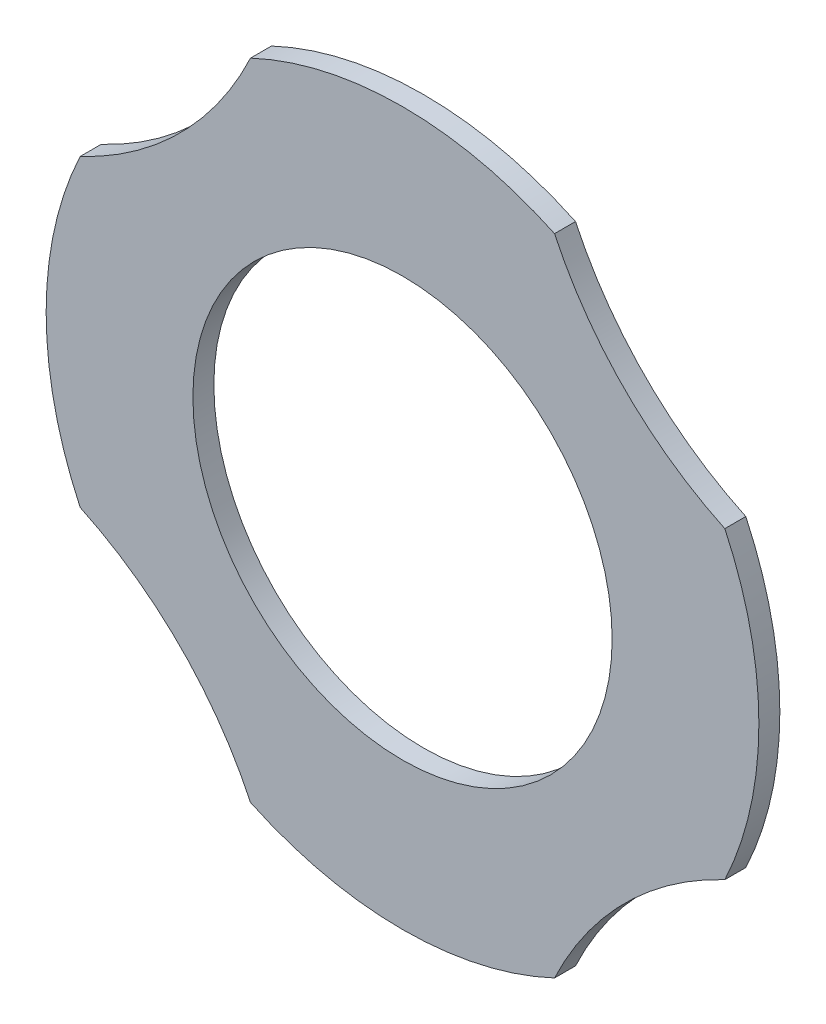
ISO-10303-21;
HEADER;
FILE_DESCRIPTION(('STEP AP214'),'2;1');
FILE_NAME('part.step','',(''),(''),'','','');
FILE_SCHEMA(('AUTOMOTIVE_DESIGN { 1 0 10303 214 1 1 1 1 }'));
ENDSEC;
DATA;
#1=APPLICATION_CONTEXT('core data for automotive mechanical design processes');
#2=APPLICATION_PROTOCOL_DEFINITION('international standard','automotive_design',2000,#1);
#3=PRODUCT_CONTEXT('',#1,'mechanical');
#4=PRODUCT('Part','Part','',(#3));
#5=PRODUCT_RELATED_PRODUCT_CATEGORY('part','',(#4));
#6=PRODUCT_DEFINITION_FORMATION('','',#4);
#7=PRODUCT_DEFINITION_CONTEXT('part definition',#1,'design');
#8=PRODUCT_DEFINITION('design','',#6,#7);
#9=PRODUCT_DEFINITION_SHAPE('','',#8);
#10=(LENGTH_UNIT() NAMED_UNIT(*) SI_UNIT(.MILLI.,.METRE.));
#11=(NAMED_UNIT(*) PLANE_ANGLE_UNIT() SI_UNIT($,.RADIAN.));
#12=(NAMED_UNIT(*) SI_UNIT($,.STERADIAN.) SOLID_ANGLE_UNIT());
#13=UNCERTAINTY_MEASURE_WITH_UNIT(LENGTH_MEASURE(1.E-05),#10,'distance_accuracy_value','');
#14=(GEOMETRIC_REPRESENTATION_CONTEXT(3) GLOBAL_UNCERTAINTY_ASSIGNED_CONTEXT((#13)) GLOBAL_UNIT_ASSIGNED_CONTEXT((#10,
#11,#12)) REPRESENTATION_CONTEXT('',''));
#15=CARTESIAN_POINT('',(0.,0.,0.));
#16=DIRECTION('',(0.,0.,1.));
#17=DIRECTION('',(1.,0.,0.));
#18=AXIS2_PLACEMENT_3D('',#15,#16,#17);
#19=CARTESIAN_POINT('',(-226.274169979693,546.274169979696,10.));
#20=DIRECTION('',(0.,0.,-1.));
#21=DIRECTION('',(-1.,0.,0.));
#22=AXIS2_PLACEMENT_3D('',#19,#20,#21);
#23=CYLINDRICAL_SURFACE('',#22,170.);
#24=CARTESIAN_POINT('',(-226.274169979693,546.274169979696,0.));
#25=DIRECTION('',(0.,0.,-1.));
#26=DIRECTION('',(1.,0.,0.));
#27=AXIS2_PLACEMENT_3D('',#24,#25,#26);
#28=CIRCLE('',#27,170.);
#29=CARTESIAN_POINT('',(-72.5168929666655,473.757277013029,0.));
#30=VERTEX_POINT('',#29);
#31=CARTESIAN_POINT('',(-153.757277013025,392.516892966669,0.));
#32=VERTEX_POINT('',#31);
#33=EDGE_CURVE('E144',#30,#32,#28,.T.);
#34=ORIENTED_EDGE('',*,*,#33,.T.);
#35=DIRECTION('',(0.,0.,-1.));
#36=VECTOR('',#35,1.);
#37=CARTESIAN_POINT('',(-153.757277013025,392.516892966669,10.));
#38=LINE('',#37,#36);
#39=CARTESIAN_POINT('',(-153.757277013025,392.516892966669,10.));
#40=VERTEX_POINT('',#39);
#41=EDGE_CURVE('E11',#40,#32,#38,.T.);
#42=ORIENTED_EDGE('',*,*,#41,.F.);
#43=CARTESIAN_POINT('',(-226.274169979693,546.274169979696,10.));
#44=DIRECTION('',(0.,0.,-1.));
#45=DIRECTION('',(1.,0.,0.));
#46=AXIS2_PLACEMENT_3D('',#43,#44,#45);
#47=CIRCLE('',#46,170.);
#48=CARTESIAN_POINT('',(-72.5168929666655,473.757277013029,10.));
#49=VERTEX_POINT('',#48);
#50=EDGE_CURVE('E167',#49,#40,#47,.T.);
#51=ORIENTED_EDGE('',*,*,#50,.F.);
#52=DIRECTION('',(0.,0.,-1.));
#53=VECTOR('',#52,1.);
#54=CARTESIAN_POINT('',(-72.5168929666655,473.757277013029,10.));
#55=LINE('',#54,#53);
#56=EDGE_CURVE('E140',#49,#30,#55,.T.);
#57=ORIENTED_EDGE('',*,*,#56,.T.);
#58=EDGE_LOOP('',(#34,#42,#51,#57));
#59=FACE_BOUND('',#58,.T.);
#60=ADVANCED_FACE('F43',(#59),#23,.F.);
#61=CARTESIAN_POINT('',(2.26207941267376E-12,320.000000000001,10.));
#62=DIRECTION('',(0.,0.,-1.));
#63=DIRECTION('',(-1.,0.,0.));
#64=AXIS2_PLACEMENT_3D('',#61,#62,#63);
#65=CYLINDRICAL_SURFACE('',#64,170.);
#66=CARTESIAN_POINT('',(2.26207941267376E-12,320.000000000001,0.));
#67=DIRECTION('',(0.,0.,1.));
#68=DIRECTION('',(-1.,0.,0.));
#69=AXIS2_PLACEMENT_3D('',#66,#67,#68);
#70=CIRCLE('',#69,170.);
#71=CARTESIAN_POINT('',(-153.757277013025,247.483107033334,0.));
#72=VERTEX_POINT('',#71);
#73=EDGE_CURVE('E148',#32,#72,#70,.T.);
#74=ORIENTED_EDGE('',*,*,#73,.T.);
#75=DIRECTION('',(0.,0.,-1.));
#76=VECTOR('',#75,1.);
#77=CARTESIAN_POINT('',(-153.757277013025,247.483107033334,10.));
#78=LINE('',#77,#76);
#79=CARTESIAN_POINT('',(-153.757277013025,247.483107033334,10.));
#80=VERTEX_POINT('',#79);
#81=EDGE_CURVE('E52',#80,#72,#78,.T.);
#82=ORIENTED_EDGE('',*,*,#81,.F.);
#83=CARTESIAN_POINT('',(2.26207941267376E-12,320.000000000001,10.));
#84=DIRECTION('',(0.,0.,1.));
#85=DIRECTION('',(-1.,0.,0.));
#86=AXIS2_PLACEMENT_3D('',#83,#84,#85);
#87=CIRCLE('',#86,170.);
#88=EDGE_CURVE('E103',#40,#80,#87,.T.);
#89=ORIENTED_EDGE('',*,*,#88,.F.);
#90=ORIENTED_EDGE('',*,*,#41,.T.);
#91=EDGE_LOOP('',(#74,#82,#89,#90));
#92=FACE_BOUND('',#91,.T.);
#93=ADVANCED_FACE('F236',(#92),#65,.T.);
#94=CARTESIAN_POINT('',(-226.274169979693,93.7258300203062,10.));
#95=DIRECTION('',(0.,0.,-1.));
#96=DIRECTION('',(-1.,0.,0.));
#97=AXIS2_PLACEMENT_3D('',#94,#95,#96);
#98=CYLINDRICAL_SURFACE('',#97,170.);
#99=CARTESIAN_POINT('',(-226.274169979693,93.7258300203062,0.));
#100=DIRECTION('',(0.,0.,-1.));
#101=DIRECTION('',(-1.,0.,0.));
#102=AXIS2_PLACEMENT_3D('',#99,#100,#101);
#103=CIRCLE('',#102,170.);
#104=CARTESIAN_POINT('',(-72.5168929666654,166.242722986974,0.));
#105=VERTEX_POINT('',#104);
#106=EDGE_CURVE('E152',#72,#105,#103,.T.);
#107=ORIENTED_EDGE('',*,*,#106,.T.);
#108=DIRECTION('',(0.,0.,-1.));
#109=VECTOR('',#108,1.);
#110=CARTESIAN_POINT('',(-72.5168929666654,166.242722986974,10.));
#111=LINE('',#110,#109);
#112=CARTESIAN_POINT('',(-72.5168929666654,166.242722986974,10.));
#113=VERTEX_POINT('',#112);
#114=EDGE_CURVE('E178',#113,#105,#111,.T.);
#115=ORIENTED_EDGE('',*,*,#114,.F.);
#116=CARTESIAN_POINT('',(-226.274169979693,93.7258300203062,10.));
#117=DIRECTION('',(0.,0.,-1.));
#118=DIRECTION('',(-1.,0.,0.));
#119=AXIS2_PLACEMENT_3D('',#116,#117,#118);
#120=CIRCLE('',#119,170.);
#121=EDGE_CURVE('E188',#80,#113,#120,.T.);
#122=ORIENTED_EDGE('',*,*,#121,.F.);
#123=ORIENTED_EDGE('',*,*,#81,.T.);
#124=EDGE_LOOP('',(#107,#115,#122,#123));
#125=FACE_BOUND('',#124,.T.);
#126=ADVANCED_FACE('F186',(#125),#98,.F.);
#127=CARTESIAN_POINT('',(2.26207941267376E-12,320.000000000001,10.));
#128=DIRECTION('',(0.,0.,-1.));
#129=DIRECTION('',(-1.,0.,0.));
#130=AXIS2_PLACEMENT_3D('',#127,#128,#129);
#131=CYLINDRICAL_SURFACE('',#130,170.);
#132=CARTESIAN_POINT('',(2.26207941267376E-12,320.000000000001,0.));
#133=DIRECTION('',(0.,0.,1.));
#134=DIRECTION('',(-1.,0.,0.));
#135=AXIS2_PLACEMENT_3D('',#132,#133,#134);
#136=CIRCLE('',#135,170.);
#137=CARTESIAN_POINT('',(72.51689296667,166.242722986974,0.));
#138=VERTEX_POINT('',#137);
#139=EDGE_CURVE('E155',#105,#138,#136,.T.);
#140=ORIENTED_EDGE('',*,*,#139,.T.);
#141=DIRECTION('',(0.,0.,-1.));
#142=VECTOR('',#141,1.);
#143=CARTESIAN_POINT('',(72.51689296667,166.242722986974,10.));
#144=LINE('',#143,#142);
#145=CARTESIAN_POINT('',(72.51689296667,166.242722986974,10.));
#146=VERTEX_POINT('',#145);
#147=EDGE_CURVE('E174',#146,#138,#144,.T.);
#148=ORIENTED_EDGE('',*,*,#147,.F.);
#149=CARTESIAN_POINT('',(2.26207941267376E-12,320.000000000001,10.));
#150=DIRECTION('',(0.,0.,1.));
#151=DIRECTION('',(-1.,0.,0.));
#152=AXIS2_PLACEMENT_3D('',#149,#150,#151);
#153=CIRCLE('',#152,170.);
#154=EDGE_CURVE('E201',#113,#146,#153,.T.);
#155=ORIENTED_EDGE('',*,*,#154,.F.);
#156=ORIENTED_EDGE('',*,*,#114,.T.);
#157=EDGE_LOOP('',(#140,#148,#155,#156));
#158=FACE_BOUND('',#157,.T.);
#159=ADVANCED_FACE('F196',(#158),#131,.T.);
#160=CARTESIAN_POINT('',(226.274169979697,93.7258300203062,10.));
#161=DIRECTION('',(0.,0.,-1.));
#162=DIRECTION('',(-1.,0.,0.));
#163=AXIS2_PLACEMENT_3D('',#160,#161,#162);
#164=CYLINDRICAL_SURFACE('',#163,170.);
#165=CARTESIAN_POINT('',(226.274169979697,93.7258300203062,0.));
#166=DIRECTION('',(0.,0.,-1.));
#167=DIRECTION('',(-1.,0.,0.));
#168=AXIS2_PLACEMENT_3D('',#165,#166,#167);
#169=CIRCLE('',#168,170.);
#170=CARTESIAN_POINT('',(153.75727701303,247.483107033334,0.));
#171=VERTEX_POINT('',#170);
#172=EDGE_CURVE('E158',#138,#171,#169,.T.);
#173=ORIENTED_EDGE('',*,*,#172,.T.);
#174=DIRECTION('',(0.,0.,-1.));
#175=VECTOR('',#174,1.);
#176=CARTESIAN_POINT('',(153.75727701303,247.483107033334,10.));
#177=LINE('',#176,#175);
#178=CARTESIAN_POINT('',(153.75727701303,247.483107033334,10.));
#179=VERTEX_POINT('',#178);
#180=EDGE_CURVE('E133',#179,#171,#177,.T.);
#181=ORIENTED_EDGE('',*,*,#180,.F.);
#182=CARTESIAN_POINT('',(226.274169979697,93.7258300203062,10.));
#183=DIRECTION('',(0.,0.,-1.));
#184=DIRECTION('',(-1.,0.,0.));
#185=AXIS2_PLACEMENT_3D('',#182,#183,#184);
#186=CIRCLE('',#185,170.);
#187=EDGE_CURVE('E122',#146,#179,#186,.T.);
#188=ORIENTED_EDGE('',*,*,#187,.F.);
#189=ORIENTED_EDGE('',*,*,#147,.T.);
#190=EDGE_LOOP('',(#173,#181,#188,#189));
#191=FACE_BOUND('',#190,.T.);
#192=ADVANCED_FACE('F199',(#191),#164,.F.);
#193=CARTESIAN_POINT('',(2.26207941267376E-12,320.000000000001,10.));
#194=DIRECTION('',(0.,0.,-1.));
#195=DIRECTION('',(-1.,0.,0.));
#196=AXIS2_PLACEMENT_3D('',#193,#194,#195);
#197=CYLINDRICAL_SURFACE('',#196,170.);
#198=CARTESIAN_POINT('',(2.26207941267376E-12,320.000000000001,0.));
#199=DIRECTION('',(0.,0.,1.));
#200=DIRECTION('',(-1.,0.,0.));
#201=AXIS2_PLACEMENT_3D('',#198,#199,#200);
#202=CIRCLE('',#201,170.);
#203=CARTESIAN_POINT('',(153.75727701303,392.516892966669,0.));
#204=VERTEX_POINT('',#203);
#205=EDGE_CURVE('E131',#171,#204,#202,.T.);
#206=ORIENTED_EDGE('',*,*,#205,.T.);
#207=DIRECTION('',(0.,0.,-1.));
#208=VECTOR('',#207,1.);
#209=CARTESIAN_POINT('',(153.75727701303,392.516892966669,10.));
#210=LINE('',#209,#208);
#211=CARTESIAN_POINT('',(153.75727701303,392.516892966669,10.));
#212=VERTEX_POINT('',#211);
#213=EDGE_CURVE('E128',#212,#204,#210,.T.);
#214=ORIENTED_EDGE('',*,*,#213,.F.);
#215=CARTESIAN_POINT('',(2.26207941267376E-12,320.000000000001,10.));
#216=DIRECTION('',(0.,0.,1.));
#217=DIRECTION('',(-1.,0.,0.));
#218=AXIS2_PLACEMENT_3D('',#215,#216,#217);
#219=CIRCLE('',#218,170.);
#220=EDGE_CURVE('E116',#179,#212,#219,.T.);
#221=ORIENTED_EDGE('',*,*,#220,.F.);
#222=ORIENTED_EDGE('',*,*,#180,.T.);
#223=EDGE_LOOP('',(#206,#214,#221,#222));
#224=FACE_BOUND('',#223,.T.);
#225=ADVANCED_FACE('F129',(#224),#197,.T.);
#226=CARTESIAN_POINT('',(226.274169979697,546.274169979697,10.));
#227=DIRECTION('',(0.,0.,-1.));
#228=DIRECTION('',(-1.,0.,0.));
#229=AXIS2_PLACEMENT_3D('',#226,#227,#228);
#230=CYLINDRICAL_SURFACE('',#229,170.);
#231=CARTESIAN_POINT('',(226.274169979697,546.274169979697,0.));
#232=DIRECTION('',(0.,0.,-1.));
#233=DIRECTION('',(1.,0.,0.));
#234=AXIS2_PLACEMENT_3D('',#231,#232,#233);
#235=CIRCLE('',#234,170.);
#236=CARTESIAN_POINT('',(72.51689296667,473.757277013029,0.));
#237=VERTEX_POINT('',#236);
#238=EDGE_CURVE('E89',#204,#237,#235,.T.);
#239=ORIENTED_EDGE('',*,*,#238,.T.);
#240=DIRECTION('',(0.,0.,-1.));
#241=VECTOR('',#240,1.);
#242=CARTESIAN_POINT('',(72.51689296667,473.757277013029,10.));
#243=LINE('',#242,#241);
#244=CARTESIAN_POINT('',(72.51689296667,473.757277013029,10.));
#245=VERTEX_POINT('',#244);
#246=EDGE_CURVE('E134',#245,#237,#243,.T.);
#247=ORIENTED_EDGE('',*,*,#246,.F.);
#248=CARTESIAN_POINT('',(226.274169979697,546.274169979697,10.));
#249=DIRECTION('',(0.,0.,-1.));
#250=DIRECTION('',(1.,0.,0.));
#251=AXIS2_PLACEMENT_3D('',#248,#249,#250);
#252=CIRCLE('',#251,170.);
#253=EDGE_CURVE('E120',#212,#245,#252,.T.);
#254=ORIENTED_EDGE('',*,*,#253,.F.);
#255=ORIENTED_EDGE('',*,*,#213,.T.);
#256=EDGE_LOOP('',(#239,#247,#254,#255));
#257=FACE_BOUND('',#256,.T.);
#258=ADVANCED_FACE('F136',(#257),#230,.F.);
#259=CARTESIAN_POINT('',(2.26207941267376E-12,320.000000000001,10.));
#260=DIRECTION('',(0.,0.,-1.));
#261=DIRECTION('',(-1.,0.,0.));
#262=AXIS2_PLACEMENT_3D('',#259,#260,#261);
#263=CYLINDRICAL_SURFACE('',#262,170.);
#264=CARTESIAN_POINT('',(2.26207941267376E-12,320.000000000001,0.));
#265=DIRECTION('',(0.,0.,1.));
#266=DIRECTION('',(-1.,0.,0.));
#267=AXIS2_PLACEMENT_3D('',#264,#265,#266);
#268=CIRCLE('',#267,170.);
#269=EDGE_CURVE('E95',#237,#30,#268,.T.);
#270=ORIENTED_EDGE('',*,*,#269,.T.);
#271=ORIENTED_EDGE('',*,*,#56,.F.);
#272=CARTESIAN_POINT('',(2.26207941267376E-12,320.000000000001,10.));
#273=DIRECTION('',(0.,0.,1.));
#274=DIRECTION('',(-1.,0.,0.));
#275=AXIS2_PLACEMENT_3D('',#272,#273,#274);
#276=CIRCLE('',#275,170.);
#277=EDGE_CURVE('E60',#245,#49,#276,.T.);
#278=ORIENTED_EDGE('',*,*,#277,.F.);
#279=ORIENTED_EDGE('',*,*,#246,.T.);
#280=EDGE_LOOP('',(#270,#271,#278,#279));
#281=FACE_BOUND('',#280,.T.);
#282=ADVANCED_FACE('F227',(#281),#263,.T.);
#283=CARTESIAN_POINT('',(-113.137084989845,433.137084989849,10.));
#284=DIRECTION('',(0.,0.,1.));
#285=DIRECTION('',(1.,0.,0.));
#286=AXIS2_PLACEMENT_3D('',#283,#284,#285);
#287=PLANE('',#286);
#288=CARTESIAN_POINT('',(2.26207941267376E-12,320.000000000001,10.));
#289=DIRECTION('',(0.,0.,1.));
#290=DIRECTION('',(1.,0.,0.));
#291=AXIS2_PLACEMENT_3D('',#288,#289,#290);
#292=CIRCLE('',#291,100.);
#293=CARTESIAN_POINT('',(100.000000000002,320.000000000001,10.));
#294=VERTEX_POINT('',#293);
#295=EDGE_CURVE('E211',#294,#294,#292,.T.);
#296=ORIENTED_EDGE('',*,*,#295,.F.);
#297=EDGE_LOOP('',(#296));
#298=FACE_BOUND('',#297,.T.);
#299=ORIENTED_EDGE('',*,*,#50,.T.);
#300=ORIENTED_EDGE('',*,*,#88,.T.);
#301=ORIENTED_EDGE('',*,*,#121,.T.);
#302=ORIENTED_EDGE('',*,*,#154,.T.);
#303=ORIENTED_EDGE('',*,*,#187,.T.);
#304=ORIENTED_EDGE('',*,*,#220,.T.);
#305=ORIENTED_EDGE('',*,*,#253,.T.);
#306=ORIENTED_EDGE('',*,*,#277,.T.);
#307=EDGE_LOOP('',(#299,#300,#301,#302,#303,#304,#305,#306));
#308=FACE_BOUND('',#307,.T.);
#309=ADVANCED_FACE('F118',(#298,#308),#287,.T.);
#310=CARTESIAN_POINT('',(-113.137084989845,433.137084989849,0.));
#311=DIRECTION('',(0.,0.,1.));
#312=DIRECTION('',(1.,0.,0.));
#313=AXIS2_PLACEMENT_3D('',#310,#311,#312);
#314=PLANE('',#313);
#315=CARTESIAN_POINT('',(2.26207941267376E-12,320.000000000001,0.));
#316=DIRECTION('',(0.,0.,1.));
#317=DIRECTION('',(1.,0.,0.));
#318=AXIS2_PLACEMENT_3D('',#315,#316,#317);
#319=CIRCLE('',#318,100.);
#320=CARTESIAN_POINT('',(100.000000000002,320.000000000001,0.));
#321=VERTEX_POINT('',#320);
#322=EDGE_CURVE('E149',#321,#321,#319,.T.);
#323=ORIENTED_EDGE('',*,*,#322,.T.);
#324=EDGE_LOOP('',(#323));
#325=FACE_BOUND('',#324,.T.);
#326=ORIENTED_EDGE('',*,*,#33,.F.);
#327=ORIENTED_EDGE('',*,*,#269,.F.);
#328=ORIENTED_EDGE('',*,*,#238,.F.);
#329=ORIENTED_EDGE('',*,*,#205,.F.);
#330=ORIENTED_EDGE('',*,*,#172,.F.);
#331=ORIENTED_EDGE('',*,*,#139,.F.);
#332=ORIENTED_EDGE('',*,*,#106,.F.);
#333=ORIENTED_EDGE('',*,*,#73,.F.);
#334=EDGE_LOOP('',(#326,#327,#328,#329,#330,#331,#332,#333));
#335=FACE_BOUND('',#334,.T.);
#336=ADVANCED_FACE('F192',(#325,#335),#314,.F.);
#337=CARTESIAN_POINT('',(2.26207941267376E-12,320.000000000001,0.));
#338=DIRECTION('',(0.,0.,1.));
#339=DIRECTION('',(1.,0.,0.));
#340=AXIS2_PLACEMENT_3D('',#337,#338,#339);
#341=CYLINDRICAL_SURFACE('',#340,100.);
#342=ORIENTED_EDGE('',*,*,#322,.F.);
#343=EDGE_LOOP('',(#342));
#344=FACE_BOUND('',#343,.T.);
#345=ORIENTED_EDGE('',*,*,#295,.T.);
#346=EDGE_LOOP('',(#345));
#347=FACE_BOUND('',#346,.T.);
#348=ADVANCED_FACE('F220',(#344,#347),#341,.F.);
#349=CLOSED_SHELL('',(#60,#93,#126,#159,#192,#225,#258,#282,#309,#336,#348));
#350=MANIFOLD_SOLID_BREP('B2',#349);
#351=ADVANCED_BREP_SHAPE_REPRESENTATION('',(#18,#350),#14);
#352=SHAPE_DEFINITION_REPRESENTATION(#9,#351);
ENDSEC;
END-ISO-10303-21;
